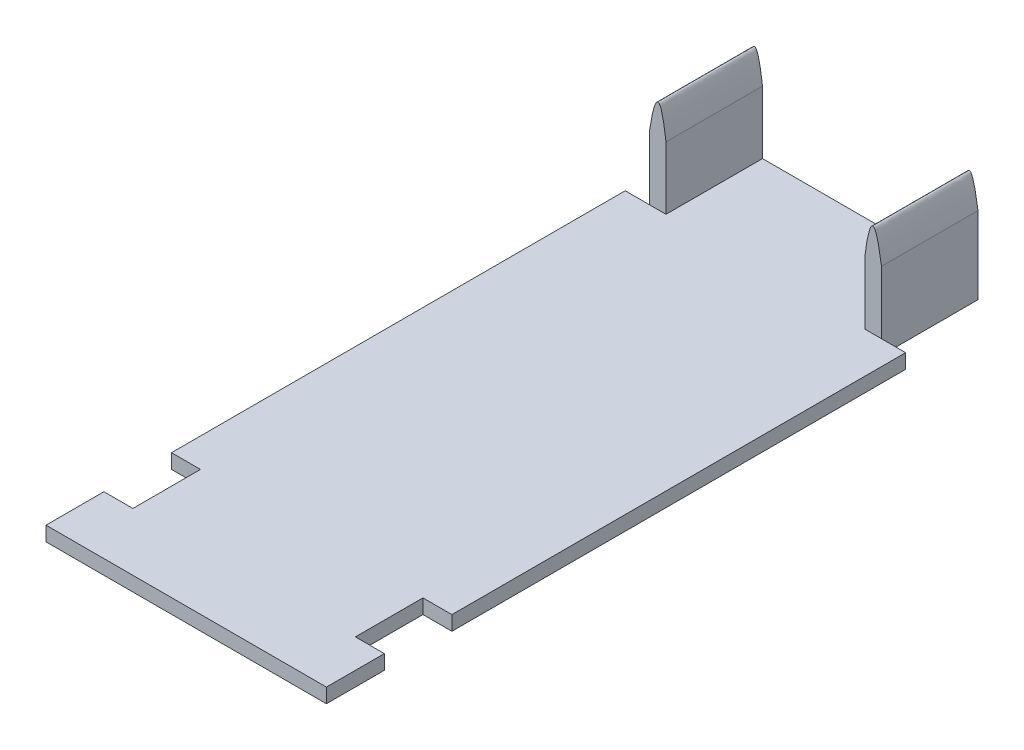
ISO-10303-21;
HEADER;
FILE_DESCRIPTION(('STEP AP214'),'2;1');
FILE_NAME('part.step','',(''),(''),'','','');
FILE_SCHEMA(('AUTOMOTIVE_DESIGN { 1 0 10303 214 1 1 1 1 }'));
ENDSEC;
DATA;
#1=APPLICATION_CONTEXT('core data for automotive mechanical design processes');
#2=APPLICATION_PROTOCOL_DEFINITION('international standard','automotive_design',2000,#1);
#3=PRODUCT_CONTEXT('',#1,'mechanical');
#4=PRODUCT('Part','Part','',(#3));
#5=PRODUCT_RELATED_PRODUCT_CATEGORY('part','',(#4));
#6=PRODUCT_DEFINITION_FORMATION('','',#4);
#7=PRODUCT_DEFINITION_CONTEXT('part definition',#1,'design');
#8=PRODUCT_DEFINITION('design','',#6,#7);
#9=PRODUCT_DEFINITION_SHAPE('','',#8);
#10=(LENGTH_UNIT() NAMED_UNIT(*) SI_UNIT(.MILLI.,.METRE.));
#11=(NAMED_UNIT(*) PLANE_ANGLE_UNIT() SI_UNIT($,.RADIAN.));
#12=(NAMED_UNIT(*) SI_UNIT($,.STERADIAN.) SOLID_ANGLE_UNIT());
#13=UNCERTAINTY_MEASURE_WITH_UNIT(LENGTH_MEASURE(1.E-05),#10,'distance_accuracy_value','');
#14=(GEOMETRIC_REPRESENTATION_CONTEXT(3) GLOBAL_UNCERTAINTY_ASSIGNED_CONTEXT((#13)) GLOBAL_UNIT_ASSIGNED_CONTEXT((#10,
#11,#12)) REPRESENTATION_CONTEXT('',''));
#15=CARTESIAN_POINT('',(0.,0.,0.));
#16=DIRECTION('',(0.,0.,1.));
#17=DIRECTION('',(1.,0.,0.));
#18=AXIS2_PLACEMENT_3D('',#15,#16,#17);
#19=CARTESIAN_POINT('',(-24.05,48.8,20.));
#20=DIRECTION('',(0.,1.,0.));
#21=DIRECTION('',(-1.,0.,0.));
#22=AXIS2_PLACEMENT_3D('',#19,#20,#21);
#23=PLANE('',#22);
#24=DIRECTION('',(0.,0.,-1.));
#25=VECTOR('',#24,1.);
#26=CARTESIAN_POINT('',(-29.05,48.8,140.));
#27=LINE('',#26,#25);
#28=CARTESIAN_POINT('',(-29.05,48.8,140.));
#29=VERTEX_POINT('',#28);
#30=CARTESIAN_POINT('',(-29.05,48.8,128.));
#31=VERTEX_POINT('',#30);
#32=EDGE_CURVE('E268',#29,#31,#27,.T.);
#33=ORIENTED_EDGE('',*,*,#32,.T.);
#34=DIRECTION('',(1.,0.,0.));
#35=VECTOR('',#34,1.);
#36=CARTESIAN_POINT('',(-24.05,48.8,128.));
#37=LINE('',#36,#35);
#38=CARTESIAN_POINT('',(-23.05,48.8,128.));
#39=VERTEX_POINT('',#38);
#40=EDGE_CURVE('E226',#31,#39,#37,.T.);
#41=ORIENTED_EDGE('',*,*,#40,.T.);
#42=DIRECTION('',(0.,0.,1.));
#43=VECTOR('',#42,1.);
#44=CARTESIAN_POINT('',(-23.05,48.8,20.));
#45=LINE('',#44,#43);
#46=CARTESIAN_POINT('',(-23.05,48.8,114.));
#47=VERTEX_POINT('',#46);
#48=EDGE_CURVE('E232',#47,#39,#45,.T.);
#49=ORIENTED_EDGE('',*,*,#48,.F.);
#50=DIRECTION('',(1.,0.,0.));
#51=VECTOR('',#50,1.);
#52=CARTESIAN_POINT('',(-24.05,48.8,114.));
#53=LINE('',#52,#51);
#54=CARTESIAN_POINT('',(-29.05,48.8,114.));
#55=VERTEX_POINT('',#54);
#56=EDGE_CURVE('E187',#55,#47,#53,.T.);
#57=ORIENTED_EDGE('',*,*,#56,.F.);
#58=CARTESIAN_POINT('',(-29.05,48.8,20.));
#59=VERTEX_POINT('',#58);
#60=EDGE_CURVE('E267',#55,#59,#27,.T.);
#61=ORIENTED_EDGE('',*,*,#60,.T.);
#62=DIRECTION('',(1.,0.,0.));
#63=VECTOR('',#62,1.);
#64=CARTESIAN_POINT('',(0.,48.8,20.));
#65=LINE('',#64,#63);
#66=CARTESIAN_POINT('',(-24.05,48.8,20.));
#67=VERTEX_POINT('',#66);
#68=EDGE_CURVE('E255',#59,#67,#65,.T.);
#69=ORIENTED_EDGE('',*,*,#68,.T.);
#70=DIRECTION('',(0.,0.,-1.));
#71=VECTOR('',#70,1.);
#72=CARTESIAN_POINT('',(-24.05,48.8,20.));
#73=LINE('',#72,#71);
#74=CARTESIAN_POINT('',(-24.05,48.8,0.));
#75=VERTEX_POINT('',#74);
#76=EDGE_CURVE('E355',#67,#75,#73,.T.);
#77=ORIENTED_EDGE('',*,*,#76,.T.);
#78=DIRECTION('',(1.,0.,0.));
#79=VECTOR('',#78,1.);
#80=CARTESIAN_POINT('',(-24.05,48.8,0.));
#81=LINE('',#80,#79);
#82=CARTESIAN_POINT('',(24.05,48.8,0.));
#83=VERTEX_POINT('',#82);
#84=EDGE_CURVE('E420',#75,#83,#81,.T.);
#85=ORIENTED_EDGE('',*,*,#84,.T.);
#86=DIRECTION('',(0.,0.,-1.));
#87=VECTOR('',#86,1.);
#88=CARTESIAN_POINT('',(24.05,48.8,20.));
#89=LINE('',#88,#87);
#90=CARTESIAN_POINT('',(24.05,48.8,20.));
#91=VERTEX_POINT('',#90);
#92=EDGE_CURVE('E360',#91,#83,#89,.T.);
#93=ORIENTED_EDGE('',*,*,#92,.F.);
#94=CARTESIAN_POINT('',(29.05,48.8,20.));
#95=VERTEX_POINT('',#94);
#96=EDGE_CURVE('E254',#91,#95,#65,.T.);
#97=ORIENTED_EDGE('',*,*,#96,.T.);
#98=DIRECTION('',(0.,0.,-1.));
#99=VECTOR('',#98,1.);
#100=CARTESIAN_POINT('',(29.05,48.8,140.));
#101=LINE('',#100,#99);
#102=CARTESIAN_POINT('',(29.05,48.8,114.));
#103=VERTEX_POINT('',#102);
#104=EDGE_CURVE('E263',#103,#95,#101,.T.);
#105=ORIENTED_EDGE('',*,*,#104,.F.);
#106=DIRECTION('',(-1.,0.,0.));
#107=VECTOR('',#106,1.);
#108=CARTESIAN_POINT('',(-24.05,48.8,114.));
#109=LINE('',#108,#107);
#110=CARTESIAN_POINT('',(23.05,48.8,114.));
#111=VERTEX_POINT('',#110);
#112=EDGE_CURVE('E65',#103,#111,#109,.T.);
#113=ORIENTED_EDGE('',*,*,#112,.T.);
#114=DIRECTION('',(0.,0.,1.));
#115=VECTOR('',#114,1.);
#116=CARTESIAN_POINT('',(23.05,48.8,20.));
#117=LINE('',#116,#115);
#118=CARTESIAN_POINT('',(23.05,48.8,128.));
#119=VERTEX_POINT('',#118);
#120=EDGE_CURVE('E229',#111,#119,#117,.T.);
#121=ORIENTED_EDGE('',*,*,#120,.T.);
#122=DIRECTION('',(-1.,0.,0.));
#123=VECTOR('',#122,1.);
#124=CARTESIAN_POINT('',(-24.05,48.8,128.));
#125=LINE('',#124,#123);
#126=CARTESIAN_POINT('',(29.05,48.8,128.));
#127=VERTEX_POINT('',#126);
#128=EDGE_CURVE('E223',#127,#119,#125,.T.);
#129=ORIENTED_EDGE('',*,*,#128,.F.);
#130=CARTESIAN_POINT('',(29.05,48.8,140.));
#131=VERTEX_POINT('',#130);
#132=EDGE_CURVE('E264',#131,#127,#101,.T.);
#133=ORIENTED_EDGE('',*,*,#132,.F.);
#134=DIRECTION('',(1.,0.,0.));
#135=VECTOR('',#134,1.);
#136=CARTESIAN_POINT('',(0.,48.8,140.));
#137=LINE('',#136,#135);
#138=EDGE_CURVE('E242',#29,#131,#137,.T.);
#139=ORIENTED_EDGE('',*,*,#138,.F.);
#140=EDGE_LOOP('',(#33,#41,#49,#57,#61,#69,#77,#85,#93,#97,#105,#113,#121,#129,#133,#139));
#141=FACE_BOUND('',#140,.T.);
#142=ADVANCED_FACE('F42',(#141),#23,.F.);
#143=CARTESIAN_POINT('',(-20.5946864211235,51.8,20.));
#144=DIRECTION('',(0.,1.,0.));
#145=DIRECTION('',(-1.,0.,0.));
#146=AXIS2_PLACEMENT_3D('',#143,#144,#145);
#147=PLANE('',#146);
#148=DIRECTION('',(1.,0.,0.));
#149=VECTOR('',#148,1.);
#150=CARTESIAN_POINT('',(0.,51.8,128.));
#151=LINE('',#150,#149);
#152=CARTESIAN_POINT('',(-29.05,51.8,128.));
#153=VERTEX_POINT('',#152);
#154=CARTESIAN_POINT('',(-23.05,51.8,128.));
#155=VERTEX_POINT('',#154);
#156=EDGE_CURVE('E191',#153,#155,#151,.T.);
#157=ORIENTED_EDGE('',*,*,#156,.F.);
#158=DIRECTION('',(0.,0.,-1.));
#159=VECTOR('',#158,1.);
#160=CARTESIAN_POINT('',(-29.05,51.8,140.));
#161=LINE('',#160,#159);
#162=CARTESIAN_POINT('',(-29.05,51.8,140.));
#163=VERTEX_POINT('',#162);
#164=EDGE_CURVE('E271',#163,#153,#161,.T.);
#165=ORIENTED_EDGE('',*,*,#164,.F.);
#166=DIRECTION('',(1.,0.,0.));
#167=VECTOR('',#166,1.);
#168=CARTESIAN_POINT('',(0.,51.8,140.));
#169=LINE('',#168,#167);
#170=CARTESIAN_POINT('',(29.05,51.8,140.));
#171=VERTEX_POINT('',#170);
#172=EDGE_CURVE('E235',#163,#171,#169,.T.);
#173=ORIENTED_EDGE('',*,*,#172,.T.);
#174=DIRECTION('',(0.,0.,-1.));
#175=VECTOR('',#174,1.);
#176=CARTESIAN_POINT('',(29.05,51.8,140.));
#177=LINE('',#176,#175);
#178=CARTESIAN_POINT('',(29.05,51.8,128.));
#179=VERTEX_POINT('',#178);
#180=EDGE_CURVE('E260',#171,#179,#177,.T.);
#181=ORIENTED_EDGE('',*,*,#180,.T.);
#182=DIRECTION('',(-1.,0.,0.));
#183=VECTOR('',#182,1.);
#184=CARTESIAN_POINT('',(0.,51.8,128.));
#185=LINE('',#184,#183);
#186=CARTESIAN_POINT('',(23.05,51.8,128.));
#187=VERTEX_POINT('',#186);
#188=EDGE_CURVE('E216',#179,#187,#185,.T.);
#189=ORIENTED_EDGE('',*,*,#188,.T.);
#190=DIRECTION('',(0.,0.,1.));
#191=VECTOR('',#190,1.);
#192=CARTESIAN_POINT('',(23.05,51.8,0.));
#193=LINE('',#192,#191);
#194=CARTESIAN_POINT('',(23.05,51.8,114.));
#195=VERTEX_POINT('',#194);
#196=EDGE_CURVE('E213',#195,#187,#193,.T.);
#197=ORIENTED_EDGE('',*,*,#196,.F.);
#198=DIRECTION('',(-1.,0.,0.));
#199=VECTOR('',#198,1.);
#200=CARTESIAN_POINT('',(0.,51.8,114.));
#201=LINE('',#200,#199);
#202=CARTESIAN_POINT('',(29.05,51.8,114.));
#203=VERTEX_POINT('',#202);
#204=EDGE_CURVE('E210',#203,#195,#201,.T.);
#205=ORIENTED_EDGE('',*,*,#204,.F.);
#206=CARTESIAN_POINT('',(29.05,51.8,20.));
#207=VERTEX_POINT('',#206);
#208=EDGE_CURVE('E246',#203,#207,#177,.T.);
#209=ORIENTED_EDGE('',*,*,#208,.T.);
#210=DIRECTION('',(1.,0.,0.));
#211=VECTOR('',#210,1.);
#212=CARTESIAN_POINT('',(0.,51.8,20.));
#213=LINE('',#212,#211);
#214=CARTESIAN_POINT('',(24.05,51.8,20.));
#215=VERTEX_POINT('',#214);
#216=EDGE_CURVE('E234',#215,#207,#213,.T.);
#217=ORIENTED_EDGE('',*,*,#216,.F.);
#218=CARTESIAN_POINT('',(20.5946864211235,51.8,20.));
#219=VERTEX_POINT('',#218);
#220=EDGE_CURVE('E251',#219,#215,#213,.T.);
#221=ORIENTED_EDGE('',*,*,#220,.F.);
#222=DIRECTION('',(0.,0.,-1.));
#223=VECTOR('',#222,1.);
#224=CARTESIAN_POINT('',(20.5946864211235,51.8,20.));
#225=LINE('',#224,#223);
#226=CARTESIAN_POINT('',(20.5946864211235,51.8,0.));
#227=VERTEX_POINT('',#226);
#228=EDGE_CURVE('E402',#219,#227,#225,.T.);
#229=ORIENTED_EDGE('',*,*,#228,.T.);
#230=DIRECTION('',(1.,0.,0.));
#231=VECTOR('',#230,1.);
#232=CARTESIAN_POINT('',(-20.5946864211235,51.8,0.));
#233=LINE('',#232,#231);
#234=CARTESIAN_POINT('',(-20.5946864211235,51.8,0.));
#235=VERTEX_POINT('',#234);
#236=EDGE_CURVE('E386',#235,#227,#233,.T.);
#237=ORIENTED_EDGE('',*,*,#236,.F.);
#238=DIRECTION('',(0.,0.,-1.));
#239=VECTOR('',#238,1.);
#240=CARTESIAN_POINT('',(-20.5946864211235,51.8,20.));
#241=LINE('',#240,#239);
#242=CARTESIAN_POINT('',(-20.5946864211235,51.8,20.));
#243=VERTEX_POINT('',#242);
#244=EDGE_CURVE('E400',#243,#235,#241,.T.);
#245=ORIENTED_EDGE('',*,*,#244,.F.);
#246=CARTESIAN_POINT('',(-24.05,51.8,20.));
#247=VERTEX_POINT('',#246);
#248=EDGE_CURVE('E350',#247,#243,#213,.T.);
#249=ORIENTED_EDGE('',*,*,#248,.F.);
#250=CARTESIAN_POINT('',(-29.05,51.8,20.));
#251=VERTEX_POINT('',#250);
#252=EDGE_CURVE('E247',#251,#247,#213,.T.);
#253=ORIENTED_EDGE('',*,*,#252,.F.);
#254=CARTESIAN_POINT('',(-29.05,51.8,114.));
#255=VERTEX_POINT('',#254);
#256=EDGE_CURVE('E205',#255,#251,#161,.T.);
#257=ORIENTED_EDGE('',*,*,#256,.F.);
#258=DIRECTION('',(1.,0.,0.));
#259=VECTOR('',#258,1.);
#260=CARTESIAN_POINT('',(0.,51.8,114.));
#261=LINE('',#260,#259);
#262=CARTESIAN_POINT('',(-23.05,51.8,114.));
#263=VERTEX_POINT('',#262);
#264=EDGE_CURVE('E57',#255,#263,#261,.T.);
#265=ORIENTED_EDGE('',*,*,#264,.T.);
#266=DIRECTION('',(0.,0.,1.));
#267=VECTOR('',#266,1.);
#268=CARTESIAN_POINT('',(-23.05,51.8,0.));
#269=LINE('',#268,#267);
#270=EDGE_CURVE('E194',#263,#155,#269,.T.);
#271=ORIENTED_EDGE('',*,*,#270,.T.);
#272=EDGE_LOOP('',(#157,#165,#173,#181,#189,#197,#205,#209,#217,#221,#229,#237,#245,#249,#253,
#257,#265,#271));
#273=FACE_BOUND('',#272,.T.);
#274=ADVANCED_FACE('F203',(#273),#147,.T.);
#275=CARTESIAN_POINT('',(-29.05,0.,140.));
#276=DIRECTION('',(-1.,0.,0.));
#277=DIRECTION('',(0.,0.,1.));
#278=AXIS2_PLACEMENT_3D('',#275,#276,#277);
#279=PLANE('',#278);
#280=ORIENTED_EDGE('',*,*,#60,.F.);
#281=DIRECTION('',(0.,1.,0.));
#282=VECTOR('',#281,1.);
#283=CARTESIAN_POINT('',(-29.05,0.,114.));
#284=LINE('',#283,#282);
#285=EDGE_CURVE('E50',#55,#255,#284,.T.);
#286=ORIENTED_EDGE('',*,*,#285,.T.);
#287=ORIENTED_EDGE('',*,*,#256,.T.);
#288=DIRECTION('',(0.,1.,0.));
#289=VECTOR('',#288,1.);
#290=CARTESIAN_POINT('',(-29.05,0.,20.));
#291=LINE('',#290,#289);
#292=EDGE_CURVE('E250',#59,#251,#291,.T.);
#293=ORIENTED_EDGE('',*,*,#292,.F.);
#294=EDGE_LOOP('',(#280,#286,#287,#293));
#295=FACE_BOUND('',#294,.T.);
#296=ADVANCED_FACE('F310',(#295),#279,.T.);
#297=CARTESIAN_POINT('',(29.05,0.,140.));
#298=DIRECTION('',(-1.,0.,0.));
#299=DIRECTION('',(0.,0.,1.));
#300=AXIS2_PLACEMENT_3D('',#297,#298,#299);
#301=PLANE('',#300);
#302=DIRECTION('',(0.,-1.,0.));
#303=VECTOR('',#302,1.);
#304=CARTESIAN_POINT('',(29.05,0.,128.));
#305=LINE('',#304,#303);
#306=EDGE_CURVE('E327',#179,#127,#305,.T.);
#307=ORIENTED_EDGE('',*,*,#306,.F.);
#308=ORIENTED_EDGE('',*,*,#180,.F.);
#309=DIRECTION('',(0.,1.,0.));
#310=VECTOR('',#309,1.);
#311=CARTESIAN_POINT('',(29.05,0.,140.));
#312=LINE('',#311,#310);
#313=EDGE_CURVE('E244',#131,#171,#312,.T.);
#314=ORIENTED_EDGE('',*,*,#313,.F.);
#315=ORIENTED_EDGE('',*,*,#132,.T.);
#316=EDGE_LOOP('',(#307,#308,#314,#315));
#317=FACE_BOUND('',#316,.T.);
#318=ADVANCED_FACE('F326',(#317),#301,.F.);
#319=CARTESIAN_POINT('',(22.2550587379189,71.1000540272372,20.));
#320=DIRECTION('',(0.,0.,-1.));
#321=DIRECTION('',(-1.,0.,0.));
#322=AXIS2_PLACEMENT_3D('',#319,#320,#321);
#323=PLANE('',#322);
#324=DIRECTION('',(0.,-1.,0.));
#325=VECTOR('',#324,1.);
#326=CARTESIAN_POINT('',(-24.05,64.8,20.));
#327=LINE('',#326,#325);
#328=CARTESIAN_POINT('',(-24.05,64.8,20.));
#329=VERTEX_POINT('',#328);
#330=EDGE_CURVE('E275',#329,#247,#327,.T.);
#331=ORIENTED_EDGE('',*,*,#330,.T.);
#332=ORIENTED_EDGE('',*,*,#248,.T.);
#333=DIRECTION('',(0.,-1.,0.));
#334=VECTOR('',#333,1.);
#335=CARTESIAN_POINT('',(-20.5946864211235,64.8,20.));
#336=LINE('',#335,#334);
#337=CARTESIAN_POINT('',(-20.5946864211235,64.8,20.));
#338=VERTEX_POINT('',#337);
#339=EDGE_CURVE('E436',#338,#243,#336,.T.);
#340=ORIENTED_EDGE('',*,*,#339,.F.);
#341=CARTESIAN_POINT('',(-24.05,64.8,20.));
#342=CARTESIAN_POINT('',(-22.1877742652761,77.4001080544743,20.));
#343=CARTESIAN_POINT('',(-20.5946864211235,64.8,20.));
#344=B_SPLINE_CURVE_WITH_KNOTS('',2,(#341,#342,#343),.UNSPECIFIED.,.F.,.F.,(3,3),(0.,1.),.UNSPECIFIED.);
#345=EDGE_CURVE('E398',#329,#338,#344,.T.);
#346=ORIENTED_EDGE('',*,*,#345,.F.);
#347=EDGE_LOOP('',(#331,#332,#340,#346));
#348=FACE_BOUND('',#347,.T.);
#349=ADVANCED_FACE('F461',(#348),#323,.F.);
#350=CARTESIAN_POINT('',(-24.05,64.8,20.));
#351=DIRECTION('',(1.,0.,0.));
#352=DIRECTION('',(0.,1.,0.));
#353=AXIS2_PLACEMENT_3D('',#350,#351,#352);
#354=PLANE('',#353);
#355=DIRECTION('',(0.,-1.,0.));
#356=VECTOR('',#355,1.);
#357=CARTESIAN_POINT('',(-24.05,64.8,0.));
#358=LINE('',#357,#356);
#359=CARTESIAN_POINT('',(-24.05,64.8,0.));
#360=VERTEX_POINT('',#359);
#361=EDGE_CURVE('E274',#360,#75,#358,.T.);
#362=ORIENTED_EDGE('',*,*,#361,.T.);
#363=ORIENTED_EDGE('',*,*,#76,.F.);
#364=EDGE_CURVE('E279',#247,#67,#327,.T.);
#365=ORIENTED_EDGE('',*,*,#364,.F.);
#366=ORIENTED_EDGE('',*,*,#330,.F.);
#367=DIRECTION('',(0.,0.,-1.));
#368=VECTOR('',#367,1.);
#369=CARTESIAN_POINT('',(-24.05,64.8,20.));
#370=LINE('',#369,#368);
#371=EDGE_CURVE('E392',#329,#360,#370,.T.);
#372=ORIENTED_EDGE('',*,*,#371,.T.);
#373=EDGE_LOOP('',(#362,#363,#365,#366,#372));
#374=FACE_BOUND('',#373,.T.);
#375=ADVANCED_FACE('F44',(#374),#354,.F.);
#376=CARTESIAN_POINT('',(24.05,64.8,20.));
#377=DIRECTION('',(1.,0.,0.));
#378=DIRECTION('',(0.,1.,0.));
#379=AXIS2_PLACEMENT_3D('',#376,#377,#378);
#380=PLANE('',#379);
#381=DIRECTION('',(0.,-1.,0.));
#382=VECTOR('',#381,1.);
#383=CARTESIAN_POINT('',(24.05,64.8,0.));
#384=LINE('',#383,#382);
#385=CARTESIAN_POINT('',(24.05,64.8,0.));
#386=VERTEX_POINT('',#385);
#387=EDGE_CURVE('E414',#386,#83,#384,.T.);
#388=ORIENTED_EDGE('',*,*,#387,.F.);
#389=DIRECTION('',(0.,0.,-1.));
#390=VECTOR('',#389,1.);
#391=CARTESIAN_POINT('',(24.05,64.8,20.));
#392=LINE('',#391,#390);
#393=CARTESIAN_POINT('',(24.05,64.8,20.));
#394=VERTEX_POINT('',#393);
#395=EDGE_CURVE('E365',#394,#386,#392,.T.);
#396=ORIENTED_EDGE('',*,*,#395,.F.);
#397=DIRECTION('',(0.,-1.,0.));
#398=VECTOR('',#397,1.);
#399=CARTESIAN_POINT('',(24.05,64.8,20.));
#400=LINE('',#399,#398);
#401=EDGE_CURVE('E280',#394,#215,#400,.T.);
#402=ORIENTED_EDGE('',*,*,#401,.T.);
#403=EDGE_CURVE('E278',#215,#91,#400,.T.);
#404=ORIENTED_EDGE('',*,*,#403,.T.);
#405=ORIENTED_EDGE('',*,*,#92,.T.);
#406=EDGE_LOOP('',(#388,#396,#402,#404,#405));
#407=FACE_BOUND('',#406,.T.);
#408=ADVANCED_FACE('F299',(#407),#380,.T.);
#409=CARTESIAN_POINT('',(24.05,64.8,20.));
#410=CARTESIAN_POINT('',(22.1877742652761,77.4001080544743,20.));
#411=CARTESIAN_POINT('',(20.5946864211235,64.8,20.));
#412=B_SPLINE_CURVE_WITH_KNOTS('',2,(#409,#410,#411),.UNSPECIFIED.,.F.,.F.,(3,3),(0.,1.),.UNSPECIFIED.);
#413=DIRECTION('',(0.,0.,-1.));
#414=VECTOR('',#413,1.);
#415=SURFACE_OF_LINEAR_EXTRUSION('',#412,#414);
#416=CARTESIAN_POINT('',(24.05,64.8,0.));
#417=CARTESIAN_POINT('',(22.1877742652761,77.4001080544743,0.));
#418=CARTESIAN_POINT('',(20.5946864211235,64.8,0.));
#419=B_SPLINE_CURVE_WITH_KNOTS('',2,(#416,#417,#418),.UNSPECIFIED.,.F.,.F.,(3,3),(0.,1.),.UNSPECIFIED.);
#420=CARTESIAN_POINT('',(20.5946864211235,64.8,0.));
#421=VERTEX_POINT('',#420);
#422=EDGE_CURVE('E409',#386,#421,#419,.T.);
#423=ORIENTED_EDGE('',*,*,#422,.T.);
#424=DIRECTION('',(0.,0.,-1.));
#425=VECTOR('',#424,1.);
#426=CARTESIAN_POINT('',(20.5946864211235,64.8,20.));
#427=LINE('',#426,#425);
#428=CARTESIAN_POINT('',(20.5946864211235,64.8,20.));
#429=VERTEX_POINT('',#428);
#430=EDGE_CURVE('E404',#429,#421,#427,.T.);
#431=ORIENTED_EDGE('',*,*,#430,.F.);
#432=EDGE_CURVE('E283',#394,#429,#412,.T.);
#433=ORIENTED_EDGE('',*,*,#432,.F.);
#434=ORIENTED_EDGE('',*,*,#395,.T.);
#435=EDGE_LOOP('',(#423,#431,#433,#434));
#436=FACE_BOUND('',#435,.T.);
#437=ADVANCED_FACE('F294',(#436),#415,.F.);
#438=CARTESIAN_POINT('',(20.5946864211236,64.8,20.));
#439=DIRECTION('',(1.,0.,0.));
#440=DIRECTION('',(0.,1.,0.));
#441=AXIS2_PLACEMENT_3D('',#438,#439,#440);
#442=PLANE('',#441);
#443=DIRECTION('',(0.,-1.,0.));
#444=VECTOR('',#443,1.);
#445=CARTESIAN_POINT('',(20.5946864211236,64.8,0.));
#446=LINE('',#445,#444);
#447=EDGE_CURVE('E417',#421,#227,#446,.T.);
#448=ORIENTED_EDGE('',*,*,#447,.T.);
#449=ORIENTED_EDGE('',*,*,#228,.F.);
#450=DIRECTION('',(0.,-1.,0.));
#451=VECTOR('',#450,1.);
#452=CARTESIAN_POINT('',(20.5946864211236,64.8,20.));
#453=LINE('',#452,#451);
#454=EDGE_CURVE('E288',#429,#219,#453,.T.);
#455=ORIENTED_EDGE('',*,*,#454,.F.);
#456=ORIENTED_EDGE('',*,*,#430,.T.);
#457=EDGE_LOOP('',(#448,#449,#455,#456));
#458=FACE_BOUND('',#457,.T.);
#459=ADVANCED_FACE('F298',(#458),#442,.F.);
#460=CARTESIAN_POINT('',(-20.5946864211235,64.8,20.));
#461=DIRECTION('',(1.,0.,0.));
#462=DIRECTION('',(0.,0.,-1.));
#463=AXIS2_PLACEMENT_3D('',#460,#461,#462);
#464=PLANE('',#463);
#465=DIRECTION('',(0.,-1.,0.));
#466=VECTOR('',#465,1.);
#467=CARTESIAN_POINT('',(-20.5946864211235,64.8,0.));
#468=LINE('',#467,#466);
#469=CARTESIAN_POINT('',(-20.5946864211235,64.8,0.));
#470=VERTEX_POINT('',#469);
#471=EDGE_CURVE('E380',#470,#235,#468,.T.);
#472=ORIENTED_EDGE('',*,*,#471,.F.);
#473=DIRECTION('',(0.,0.,-1.));
#474=VECTOR('',#473,1.);
#475=CARTESIAN_POINT('',(-20.5946864211235,64.8,20.));
#476=LINE('',#475,#474);
#477=EDGE_CURVE('E397',#338,#470,#476,.T.);
#478=ORIENTED_EDGE('',*,*,#477,.F.);
#479=ORIENTED_EDGE('',*,*,#339,.T.);
#480=ORIENTED_EDGE('',*,*,#244,.T.);
#481=EDGE_LOOP('',(#472,#478,#479,#480));
#482=FACE_BOUND('',#481,.T.);
#483=ADVANCED_FACE('F452',(#482),#464,.T.);
#484=DIRECTION('',(0.,0.,-1.));
#485=VECTOR('',#484,1.);
#486=SURFACE_OF_LINEAR_EXTRUSION('',#344,#485);
#487=CARTESIAN_POINT('',(-24.05,64.8,0.));
#488=CARTESIAN_POINT('',(-22.1877742652761,77.4001080544743,0.));
#489=CARTESIAN_POINT('',(-20.5946864211235,64.8,0.));
#490=B_SPLINE_CURVE_WITH_KNOTS('',2,(#487,#488,#489),.UNSPECIFIED.,.F.,.F.,(3,3),(0.,1.),.UNSPECIFIED.);
#491=EDGE_CURVE('E378',#360,#470,#490,.T.);
#492=ORIENTED_EDGE('',*,*,#491,.F.);
#493=ORIENTED_EDGE('',*,*,#371,.F.);
#494=ORIENTED_EDGE('',*,*,#345,.T.);
#495=ORIENTED_EDGE('',*,*,#477,.T.);
#496=EDGE_LOOP('',(#492,#493,#494,#495));
#497=FACE_BOUND('',#496,.T.);
#498=ADVANCED_FACE('F447',(#497),#486,.T.);
#499=ORIENTED_EDGE('',*,*,#454,.T.);
#500=ORIENTED_EDGE('',*,*,#220,.T.);
#501=ORIENTED_EDGE('',*,*,#401,.F.);
#502=ORIENTED_EDGE('',*,*,#432,.T.);
#503=EDGE_LOOP('',(#499,#500,#501,#502));
#504=FACE_BOUND('',#503,.T.);
#505=ADVANCED_FACE('F451',(#504),#323,.F.);
#506=CARTESIAN_POINT('',(22.2550587379189,71.1000540272372,0.));
#507=DIRECTION('',(0.,0.,-1.));
#508=DIRECTION('',(-1.,0.,0.));
#509=AXIS2_PLACEMENT_3D('',#506,#507,#508);
#510=PLANE('',#509);
#511=ORIENTED_EDGE('',*,*,#361,.F.);
#512=ORIENTED_EDGE('',*,*,#491,.T.);
#513=ORIENTED_EDGE('',*,*,#471,.T.);
#514=ORIENTED_EDGE('',*,*,#236,.T.);
#515=ORIENTED_EDGE('',*,*,#447,.F.);
#516=ORIENTED_EDGE('',*,*,#422,.F.);
#517=ORIENTED_EDGE('',*,*,#387,.T.);
#518=ORIENTED_EDGE('',*,*,#84,.F.);
#519=EDGE_LOOP('',(#511,#512,#513,#514,#515,#516,#517,#518));
#520=FACE_BOUND('',#519,.T.);
#521=ADVANCED_FACE('F413',(#520),#510,.T.);
#522=CARTESIAN_POINT('',(0.,0.,20.));
#523=DIRECTION('',(0.,0.,1.));
#524=DIRECTION('',(1.,0.,0.));
#525=AXIS2_PLACEMENT_3D('',#522,#523,#524);
#526=PLANE('',#525);
#527=ORIENTED_EDGE('',*,*,#252,.T.);
#528=ORIENTED_EDGE('',*,*,#364,.T.);
#529=ORIENTED_EDGE('',*,*,#68,.F.);
#530=ORIENTED_EDGE('',*,*,#292,.T.);
#531=EDGE_LOOP('',(#527,#528,#529,#530));
#532=FACE_BOUND('',#531,.T.);
#533=ADVANCED_FACE('F374',(#532),#526,.F.);
#534=DIRECTION('',(0.,1.,0.));
#535=VECTOR('',#534,1.);
#536=CARTESIAN_POINT('',(-29.05,0.,128.));
#537=LINE('',#536,#535);
#538=EDGE_CURVE('E11',#31,#153,#537,.T.);
#539=ORIENTED_EDGE('',*,*,#538,.F.);
#540=ORIENTED_EDGE('',*,*,#32,.F.);
#541=DIRECTION('',(0.,1.,0.));
#542=VECTOR('',#541,1.);
#543=CARTESIAN_POINT('',(-29.05,0.,140.));
#544=LINE('',#543,#542);
#545=EDGE_CURVE('E238',#29,#163,#544,.T.);
#546=ORIENTED_EDGE('',*,*,#545,.T.);
#547=ORIENTED_EDGE('',*,*,#164,.T.);
#548=EDGE_LOOP('',(#539,#540,#546,#547));
#549=FACE_BOUND('',#548,.T.);
#550=ADVANCED_FACE('F316',(#549),#279,.T.);
#551=ORIENTED_EDGE('',*,*,#208,.F.);
#552=DIRECTION('',(0.,-1.,0.));
#553=VECTOR('',#552,1.);
#554=CARTESIAN_POINT('',(29.05,0.,114.));
#555=LINE('',#554,#553);
#556=EDGE_CURVE('E337',#203,#103,#555,.T.);
#557=ORIENTED_EDGE('',*,*,#556,.T.);
#558=ORIENTED_EDGE('',*,*,#104,.T.);
#559=DIRECTION('',(0.,1.,0.));
#560=VECTOR('',#559,1.);
#561=CARTESIAN_POINT('',(29.05,0.,20.));
#562=LINE('',#561,#560);
#563=EDGE_CURVE('E239',#95,#207,#562,.T.);
#564=ORIENTED_EDGE('',*,*,#563,.T.);
#565=EDGE_LOOP('',(#551,#557,#558,#564));
#566=FACE_BOUND('',#565,.T.);
#567=ADVANCED_FACE('F341',(#566),#301,.F.);
#568=CARTESIAN_POINT('',(0.,0.,140.));
#569=DIRECTION('',(0.,0.,1.));
#570=DIRECTION('',(1.,0.,0.));
#571=AXIS2_PLACEMENT_3D('',#568,#569,#570);
#572=PLANE('',#571);
#573=ORIENTED_EDGE('',*,*,#172,.F.);
#574=ORIENTED_EDGE('',*,*,#545,.F.);
#575=ORIENTED_EDGE('',*,*,#138,.T.);
#576=ORIENTED_EDGE('',*,*,#313,.T.);
#577=EDGE_LOOP('',(#573,#574,#575,#576));
#578=FACE_BOUND('',#577,.T.);
#579=ADVANCED_FACE('F321',(#578),#572,.T.);
#580=ORIENTED_EDGE('',*,*,#403,.F.);
#581=ORIENTED_EDGE('',*,*,#216,.T.);
#582=ORIENTED_EDGE('',*,*,#563,.F.);
#583=ORIENTED_EDGE('',*,*,#96,.F.);
#584=EDGE_LOOP('',(#580,#581,#582,#583));
#585=FACE_BOUND('',#584,.T.);
#586=ADVANCED_FACE('F347',(#585),#526,.F.);
#587=CARTESIAN_POINT('',(23.05,41.8,0.));
#588=DIRECTION('',(-1.,0.,0.));
#589=DIRECTION('',(0.,-1.,0.));
#590=AXIS2_PLACEMENT_3D('',#587,#588,#589);
#591=PLANE('',#590);
#592=DIRECTION('',(0.,1.,0.));
#593=VECTOR('',#592,1.);
#594=CARTESIAN_POINT('',(23.05,41.8,114.));
#595=LINE('',#594,#593);
#596=EDGE_CURVE('E219',#111,#195,#595,.T.);
#597=ORIENTED_EDGE('',*,*,#596,.T.);
#598=ORIENTED_EDGE('',*,*,#196,.T.);
#599=DIRECTION('',(0.,1.,0.));
#600=VECTOR('',#599,1.);
#601=CARTESIAN_POINT('',(23.05,41.8,128.));
#602=LINE('',#601,#600);
#603=EDGE_CURVE('E200',#119,#187,#602,.T.);
#604=ORIENTED_EDGE('',*,*,#603,.F.);
#605=ORIENTED_EDGE('',*,*,#120,.F.);
#606=EDGE_LOOP('',(#597,#598,#604,#605));
#607=FACE_BOUND('',#606,.T.);
#608=ADVANCED_FACE('F335',(#607),#591,.F.);
#609=CARTESIAN_POINT('',(0.,41.8,128.));
#610=DIRECTION('',(0.,0.,-1.));
#611=DIRECTION('',(-1.,0.,0.));
#612=AXIS2_PLACEMENT_3D('',#609,#610,#611);
#613=PLANE('',#612);
#614=ORIENTED_EDGE('',*,*,#128,.T.);
#615=ORIENTED_EDGE('',*,*,#603,.T.);
#616=ORIENTED_EDGE('',*,*,#188,.F.);
#617=ORIENTED_EDGE('',*,*,#306,.T.);
#618=EDGE_LOOP('',(#614,#615,#616,#617));
#619=FACE_BOUND('',#618,.T.);
#620=ADVANCED_FACE('F331',(#619),#613,.T.);
#621=CARTESIAN_POINT('',(0.,41.8,114.));
#622=DIRECTION('',(0.,0.,-1.));
#623=DIRECTION('',(-1.,0.,0.));
#624=AXIS2_PLACEMENT_3D('',#621,#622,#623);
#625=PLANE('',#624);
#626=ORIENTED_EDGE('',*,*,#556,.F.);
#627=ORIENTED_EDGE('',*,*,#204,.T.);
#628=ORIENTED_EDGE('',*,*,#596,.F.);
#629=ORIENTED_EDGE('',*,*,#112,.F.);
#630=EDGE_LOOP('',(#626,#627,#628,#629));
#631=FACE_BOUND('',#630,.T.);
#632=ADVANCED_FACE('F336',(#631),#625,.F.);
#633=CARTESIAN_POINT('',(-23.05,41.8,0.));
#634=DIRECTION('',(-1.,0.,0.));
#635=DIRECTION('',(0.,-1.,0.));
#636=AXIS2_PLACEMENT_3D('',#633,#634,#635);
#637=PLANE('',#636);
#638=ORIENTED_EDGE('',*,*,#48,.T.);
#639=DIRECTION('',(0.,1.,0.));
#640=VECTOR('',#639,1.);
#641=CARTESIAN_POINT('',(-23.05,41.8,128.));
#642=LINE('',#641,#640);
#643=EDGE_CURVE('E190',#39,#155,#642,.T.);
#644=ORIENTED_EDGE('',*,*,#643,.T.);
#645=ORIENTED_EDGE('',*,*,#270,.F.);
#646=DIRECTION('',(0.,1.,0.));
#647=VECTOR('',#646,1.);
#648=CARTESIAN_POINT('',(-23.05,41.8,114.));
#649=LINE('',#648,#647);
#650=EDGE_CURVE('E183',#47,#263,#649,.T.);
#651=ORIENTED_EDGE('',*,*,#650,.F.);
#652=EDGE_LOOP('',(#638,#644,#645,#651));
#653=FACE_BOUND('',#652,.T.);
#654=ADVANCED_FACE('F195',(#653),#637,.T.);
#655=CARTESIAN_POINT('',(0.,41.8,128.));
#656=DIRECTION('',(0.,0.,1.));
#657=DIRECTION('',(1.,0.,0.));
#658=AXIS2_PLACEMENT_3D('',#655,#656,#657);
#659=PLANE('',#658);
#660=ORIENTED_EDGE('',*,*,#538,.T.);
#661=ORIENTED_EDGE('',*,*,#156,.T.);
#662=ORIENTED_EDGE('',*,*,#643,.F.);
#663=ORIENTED_EDGE('',*,*,#40,.F.);
#664=EDGE_LOOP('',(#660,#661,#662,#663));
#665=FACE_BOUND('',#664,.T.);
#666=ADVANCED_FACE('F318',(#665),#659,.F.);
#667=CARTESIAN_POINT('',(0.,41.8,114.));
#668=DIRECTION('',(0.,0.,1.));
#669=DIRECTION('',(1.,0.,0.));
#670=AXIS2_PLACEMENT_3D('',#667,#668,#669);
#671=PLANE('',#670);
#672=ORIENTED_EDGE('',*,*,#56,.T.);
#673=ORIENTED_EDGE('',*,*,#650,.T.);
#674=ORIENTED_EDGE('',*,*,#264,.F.);
#675=ORIENTED_EDGE('',*,*,#285,.F.);
#676=EDGE_LOOP('',(#672,#673,#674,#675));
#677=FACE_BOUND('',#676,.T.);
#678=ADVANCED_FACE('F185',(#677),#671,.T.);
#679=CLOSED_SHELL('',(#142,#274,#296,#318,#349,#375,#408,#437,#459,#483,#498,#505,#521,#533,
#550,#567,#579,#586,#608,#620,#632,#654,#666,#678));
#680=MANIFOLD_SOLID_BREP('B2',#679);
#681=ADVANCED_BREP_SHAPE_REPRESENTATION('',(#18,#680),#14);
#682=SHAPE_DEFINITION_REPRESENTATION(#9,#681);
ENDSEC;
END-ISO-10303-21;
